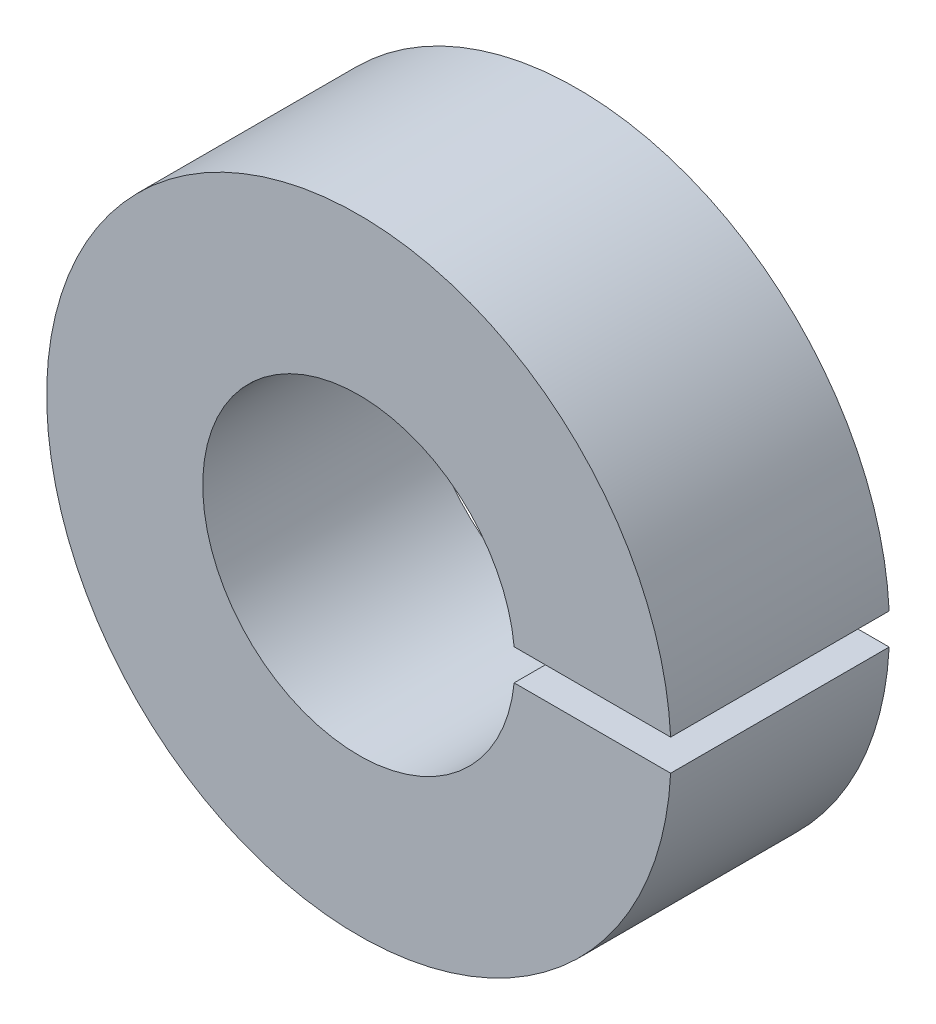
ISO-10303-21;
HEADER;
FILE_DESCRIPTION(('STEP AP214'),'2;1');
FILE_NAME('part.step','',(''),(''),'','','');
FILE_SCHEMA(('AUTOMOTIVE_DESIGN { 1 0 10303 214 1 1 1 1 }'));
ENDSEC;
DATA;
#1=APPLICATION_CONTEXT('core data for automotive mechanical design processes');
#2=APPLICATION_PROTOCOL_DEFINITION('international standard','automotive_design',2000,#1);
#3=PRODUCT_CONTEXT('',#1,'mechanical');
#4=PRODUCT('Part','Part','',(#3));
#5=PRODUCT_RELATED_PRODUCT_CATEGORY('part','',(#4));
#6=PRODUCT_DEFINITION_FORMATION('','',#4);
#7=PRODUCT_DEFINITION_CONTEXT('part definition',#1,'design');
#8=PRODUCT_DEFINITION('design','',#6,#7);
#9=PRODUCT_DEFINITION_SHAPE('','',#8);
#10=(LENGTH_UNIT() NAMED_UNIT(*) SI_UNIT(.MILLI.,.METRE.));
#11=(NAMED_UNIT(*) PLANE_ANGLE_UNIT() SI_UNIT($,.RADIAN.));
#12=(NAMED_UNIT(*) SI_UNIT($,.STERADIAN.) SOLID_ANGLE_UNIT());
#13=UNCERTAINTY_MEASURE_WITH_UNIT(LENGTH_MEASURE(1.E-05),#10,'distance_accuracy_value','');
#14=(GEOMETRIC_REPRESENTATION_CONTEXT(3) GLOBAL_UNCERTAINTY_ASSIGNED_CONTEXT((#13)) GLOBAL_UNIT_ASSIGNED_CONTEXT((#10,
#11,#12)) REPRESENTATION_CONTEXT('',''));
#15=CARTESIAN_POINT('',(0.,0.,0.));
#16=DIRECTION('',(0.,0.,1.));
#17=DIRECTION('',(1.,0.,0.));
#18=AXIS2_PLACEMENT_3D('',#15,#16,#17);
#19=CARTESIAN_POINT('',(0.,0.,7.));
#20=DIRECTION('',(0.,0.,1.));
#21=DIRECTION('',(1.,0.,0.));
#22=AXIS2_PLACEMENT_3D('',#19,#20,#21);
#23=PLANE('',#22);
#24=CARTESIAN_POINT('',(0.,0.,7.));
#25=DIRECTION('',(0.,0.,1.));
#26=DIRECTION('',(1.,0.,0.));
#27=AXIS2_PLACEMENT_3D('',#24,#25,#26);
#28=CIRCLE('',#27,20.);
#29=CARTESIAN_POINT('',(19.9749843554382,1.,7.));
#30=VERTEX_POINT('',#29);
#31=CARTESIAN_POINT('',(19.9749843554382,-1.,7.));
#32=VERTEX_POINT('',#31);
#33=EDGE_CURVE('E102',#30,#32,#28,.T.);
#34=ORIENTED_EDGE('',*,*,#33,.T.);
#35=DIRECTION('',(1.,0.,0.));
#36=VECTOR('',#35,1.);
#37=CARTESIAN_POINT('',(9.,-1.,7.));
#38=LINE('',#37,#36);
#39=CARTESIAN_POINT('',(9.9498743710662,-1.,7.));
#40=VERTEX_POINT('',#39);
#41=EDGE_CURVE('E94',#40,#32,#38,.T.);
#42=ORIENTED_EDGE('',*,*,#41,.F.);
#43=CARTESIAN_POINT('',(0.,0.,7.));
#44=DIRECTION('',(0.,0.,1.));
#45=DIRECTION('',(1.,0.,0.));
#46=AXIS2_PLACEMENT_3D('',#43,#44,#45);
#47=CIRCLE('',#46,10.);
#48=CARTESIAN_POINT('',(9.9498743710662,1.,7.));
#49=VERTEX_POINT('',#48);
#50=EDGE_CURVE('E108',#49,#40,#47,.T.);
#51=ORIENTED_EDGE('',*,*,#50,.F.);
#52=DIRECTION('',(-1.,0.,0.));
#53=VECTOR('',#52,1.);
#54=CARTESIAN_POINT('',(21.,1.,7.));
#55=LINE('',#54,#53);
#56=EDGE_CURVE('E69',#30,#49,#55,.T.);
#57=ORIENTED_EDGE('',*,*,#56,.F.);
#58=EDGE_LOOP('',(#34,#42,#51,#57));
#59=FACE_BOUND('',#58,.T.);
#60=ADVANCED_FACE('F45',(#59),#23,.T.);
#61=CARTESIAN_POINT('',(0.,0.,-7.));
#62=DIRECTION('',(0.,0.,1.));
#63=DIRECTION('',(1.,0.,0.));
#64=AXIS2_PLACEMENT_3D('',#61,#62,#63);
#65=PLANE('',#64);
#66=DIRECTION('',(1.,0.,0.));
#67=VECTOR('',#66,1.);
#68=CARTESIAN_POINT('',(9.,-1.,-7.));
#69=LINE('',#68,#67);
#70=CARTESIAN_POINT('',(9.9498743710662,-1.,-7.));
#71=VERTEX_POINT('',#70);
#72=CARTESIAN_POINT('',(19.9749843554382,-1.,-7.));
#73=VERTEX_POINT('',#72);
#74=EDGE_CURVE('E62',#71,#73,#69,.T.);
#75=ORIENTED_EDGE('',*,*,#74,.T.);
#76=CARTESIAN_POINT('',(0.,0.,-7.));
#77=DIRECTION('',(0.,0.,1.));
#78=DIRECTION('',(1.,0.,0.));
#79=AXIS2_PLACEMENT_3D('',#76,#77,#78);
#80=CIRCLE('',#79,20.);
#81=CARTESIAN_POINT('',(19.9749843554382,1.,-7.));
#82=VERTEX_POINT('',#81);
#83=EDGE_CURVE('E100',#82,#73,#80,.T.);
#84=ORIENTED_EDGE('',*,*,#83,.F.);
#85=DIRECTION('',(-1.,0.,0.));
#86=VECTOR('',#85,1.);
#87=CARTESIAN_POINT('',(21.,1.,-7.));
#88=LINE('',#87,#86);
#89=CARTESIAN_POINT('',(9.9498743710662,1.,-7.));
#90=VERTEX_POINT('',#89);
#91=EDGE_CURVE('E85',#82,#90,#88,.T.);
#92=ORIENTED_EDGE('',*,*,#91,.T.);
#93=CARTESIAN_POINT('',(0.,0.,-7.));
#94=DIRECTION('',(0.,0.,1.));
#95=DIRECTION('',(1.,0.,0.));
#96=AXIS2_PLACEMENT_3D('',#93,#94,#95);
#97=CIRCLE('',#96,10.);
#98=EDGE_CURVE('E116',#90,#71,#97,.T.);
#99=ORIENTED_EDGE('',*,*,#98,.T.);
#100=EDGE_LOOP('',(#75,#84,#92,#99));
#101=FACE_BOUND('',#100,.T.);
#102=ADVANCED_FACE('F106',(#101),#65,.F.);
#103=CARTESIAN_POINT('',(0.,0.,7.));
#104=DIRECTION('',(0.,0.,-1.));
#105=DIRECTION('',(-1.,0.,0.));
#106=AXIS2_PLACEMENT_3D('',#103,#104,#105);
#107=CYLINDRICAL_SURFACE('',#106,20.);
#108=DIRECTION('',(0.,0.,-1.));
#109=VECTOR('',#108,1.);
#110=CARTESIAN_POINT('',(19.9749843554382,-1.,7.));
#111=LINE('',#110,#109);
#112=EDGE_CURVE('E104',#32,#73,#111,.T.);
#113=ORIENTED_EDGE('',*,*,#112,.F.);
#114=ORIENTED_EDGE('',*,*,#33,.F.);
#115=DIRECTION('',(0.,0.,-1.));
#116=VECTOR('',#115,1.);
#117=CARTESIAN_POINT('',(19.9749843554382,1.,7.));
#118=LINE('',#117,#116);
#119=EDGE_CURVE('E88',#82,#30,#118,.F.);
#120=ORIENTED_EDGE('',*,*,#119,.F.);
#121=ORIENTED_EDGE('',*,*,#83,.T.);
#122=EDGE_LOOP('',(#113,#114,#120,#121));
#123=FACE_BOUND('',#122,.T.);
#124=ADVANCED_FACE('F47',(#123),#107,.T.);
#125=CARTESIAN_POINT('',(0.,0.,7.));
#126=DIRECTION('',(0.,0.,-1.));
#127=DIRECTION('',(-1.,0.,0.));
#128=AXIS2_PLACEMENT_3D('',#125,#126,#127);
#129=CYLINDRICAL_SURFACE('',#128,10.);
#130=ORIENTED_EDGE('',*,*,#50,.T.);
#131=DIRECTION('',(0.,0.,-1.));
#132=VECTOR('',#131,1.);
#133=CARTESIAN_POINT('',(9.9498743710662,-1.,7.));
#134=LINE('',#133,#132);
#135=EDGE_CURVE('E11',#40,#71,#134,.T.);
#136=ORIENTED_EDGE('',*,*,#135,.T.);
#137=ORIENTED_EDGE('',*,*,#98,.F.);
#138=DIRECTION('',(0.,0.,-1.));
#139=VECTOR('',#138,1.);
#140=CARTESIAN_POINT('',(9.9498743710662,1.,7.));
#141=LINE('',#140,#139);
#142=EDGE_CURVE('E55',#90,#49,#141,.F.);
#143=ORIENTED_EDGE('',*,*,#142,.T.);
#144=EDGE_LOOP('',(#130,#136,#137,#143));
#145=FACE_BOUND('',#144,.T.);
#146=ADVANCED_FACE('F125',(#145),#129,.F.);
#147=CARTESIAN_POINT('',(21.,1.,7.));
#148=DIRECTION('',(0.,-1.,0.));
#149=DIRECTION('',(0.,0.,-1.));
#150=AXIS2_PLACEMENT_3D('',#147,#148,#149);
#151=PLANE('',#150);
#152=CARTESIAN_POINT('',(15.,1.,0.));
#153=DIRECTION('',(0.,-1.,0.));
#154=DIRECTION('',(0.,0.,-1.));
#155=AXIS2_PLACEMENT_3D('',#152,#153,#154);
#156=CIRCLE('',#155,2.25);
#157=CARTESIAN_POINT('',(15.,1.,-2.25));
#158=VERTEX_POINT('',#157);
#159=EDGE_CURVE('E133',#158,#158,#156,.F.);
#160=ORIENTED_EDGE('',*,*,#159,.T.);
#161=EDGE_LOOP('',(#160));
#162=FACE_BOUND('',#161,.T.);
#163=ORIENTED_EDGE('',*,*,#119,.T.);
#164=ORIENTED_EDGE('',*,*,#56,.T.);
#165=ORIENTED_EDGE('',*,*,#142,.F.);
#166=ORIENTED_EDGE('',*,*,#91,.F.);
#167=EDGE_LOOP('',(#163,#164,#165,#166));
#168=FACE_BOUND('',#167,.T.);
#169=ADVANCED_FACE('F87',(#162,#168),#151,.T.);
#170=CARTESIAN_POINT('',(9.,-1.,7.));
#171=DIRECTION('',(0.,1.,0.));
#172=DIRECTION('',(0.,0.,1.));
#173=AXIS2_PLACEMENT_3D('',#170,#171,#172);
#174=PLANE('',#173);
#175=CARTESIAN_POINT('',(15.,-1.,0.));
#176=DIRECTION('',(0.,1.,0.));
#177=DIRECTION('',(0.,0.,1.));
#178=AXIS2_PLACEMENT_3D('',#175,#176,#177);
#179=CIRCLE('',#178,2.25);
#180=CARTESIAN_POINT('',(15.,-1.,2.25));
#181=VERTEX_POINT('',#180);
#182=EDGE_CURVE('E49',#181,#181,#179,.F.);
#183=ORIENTED_EDGE('',*,*,#182,.T.);
#184=EDGE_LOOP('',(#183));
#185=FACE_BOUND('',#184,.T.);
#186=ORIENTED_EDGE('',*,*,#112,.T.);
#187=ORIENTED_EDGE('',*,*,#74,.F.);
#188=ORIENTED_EDGE('',*,*,#135,.F.);
#189=ORIENTED_EDGE('',*,*,#41,.T.);
#190=EDGE_LOOP('',(#186,#187,#188,#189));
#191=FACE_BOUND('',#190,.T.);
#192=ADVANCED_FACE('F177',(#185,#191),#174,.T.);
#193=CARTESIAN_POINT('',(15.,-7.,0.));
#194=DIRECTION('',(0.,1.,0.));
#195=DIRECTION('',(0.,0.,1.));
#196=AXIS2_PLACEMENT_3D('',#193,#194,#195);
#197=PLANE('',#196);
#198=CARTESIAN_POINT('',(15.,-7.,0.));
#199=DIRECTION('',(0.,1.,0.));
#200=DIRECTION('',(0.,0.,1.));
#201=AXIS2_PLACEMENT_3D('',#198,#199,#200);
#202=CIRCLE('',#201,2.25);
#203=CARTESIAN_POINT('',(15.,-7.,2.25));
#204=VERTEX_POINT('',#203);
#205=EDGE_CURVE('E139',#204,#204,#202,.T.);
#206=ORIENTED_EDGE('',*,*,#205,.T.);
#207=EDGE_LOOP('',(#206));
#208=FACE_BOUND('',#207,.T.);
#209=ADVANCED_FACE('F166',(#208),#197,.T.);
#210=CARTESIAN_POINT('',(15.,7.,0.));
#211=DIRECTION('',(0.,-1.,0.));
#212=DIRECTION('',(0.,0.,-1.));
#213=AXIS2_PLACEMENT_3D('',#210,#211,#212);
#214=CYLINDRICAL_SURFACE('',#213,2.25);
#215=ORIENTED_EDGE('',*,*,#182,.F.);
#216=EDGE_LOOP('',(#215));
#217=FACE_BOUND('',#216,.T.);
#218=ORIENTED_EDGE('',*,*,#205,.F.);
#219=EDGE_LOOP('',(#218));
#220=FACE_BOUND('',#219,.T.);
#221=ADVANCED_FACE('F159',(#217,#220),#214,.F.);
#222=ORIENTED_EDGE('',*,*,#159,.F.);
#223=EDGE_LOOP('',(#222));
#224=FACE_BOUND('',#223,.T.);
#225=CARTESIAN_POINT('',(15.,7.,0.));
#226=DIRECTION('',(0.,1.,0.));
#227=DIRECTION('',(0.,0.,1.));
#228=AXIS2_PLACEMENT_3D('',#225,#226,#227);
#229=CIRCLE('',#228,2.25);
#230=CARTESIAN_POINT('',(15.,7.,2.25));
#231=VERTEX_POINT('',#230);
#232=EDGE_CURVE('E141',#231,#231,#229,.T.);
#233=ORIENTED_EDGE('',*,*,#232,.T.);
#234=EDGE_LOOP('',(#233));
#235=FACE_BOUND('',#234,.T.);
#236=ADVANCED_FACE('F156',(#224,#235),#214,.F.);
#237=CARTESIAN_POINT('',(15.,7.,0.));
#238=DIRECTION('',(0.,1.,0.));
#239=DIRECTION('',(0.,0.,1.));
#240=AXIS2_PLACEMENT_3D('',#237,#238,#239);
#241=PLANE('',#240);
#242=ORIENTED_EDGE('',*,*,#232,.F.);
#243=EDGE_LOOP('',(#242));
#244=FACE_BOUND('',#243,.T.);
#245=ADVANCED_FACE('F158',(#244),#241,.F.);
#246=CLOSED_SHELL('',(#60,#102,#124,#146,#169,#192,#209,#221,#236,#245));
#247=MANIFOLD_SOLID_BREP('B2',#246);
#248=ADVANCED_BREP_SHAPE_REPRESENTATION('',(#18,#247),#14);
#249=SHAPE_DEFINITION_REPRESENTATION(#9,#248);
ENDSEC;
END-ISO-10303-21;
